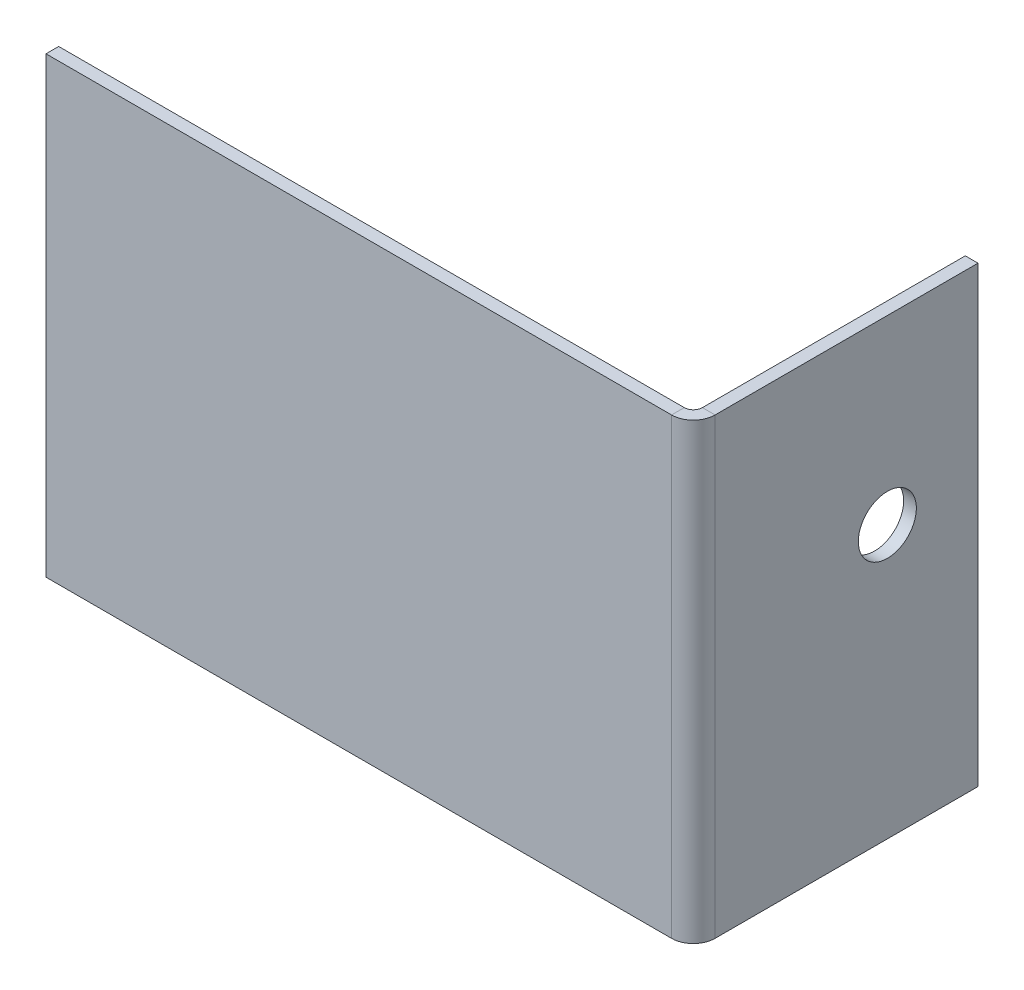
ISO-10303-21;
HEADER;
FILE_DESCRIPTION(('STEP AP214'),'2;1');
FILE_NAME('part.step','',(''),(''),'','','');
FILE_SCHEMA(('AUTOMOTIVE_DESIGN { 1 0 10303 214 1 1 1 1 }'));
ENDSEC;
DATA;
#1=APPLICATION_CONTEXT('core data for automotive mechanical design processes');
#2=APPLICATION_PROTOCOL_DEFINITION('international standard','automotive_design',2000,#1);
#3=PRODUCT_CONTEXT('',#1,'mechanical');
#4=PRODUCT('Part','Part','',(#3));
#5=PRODUCT_RELATED_PRODUCT_CATEGORY('part','',(#4));
#6=PRODUCT_DEFINITION_FORMATION('','',#4);
#7=PRODUCT_DEFINITION_CONTEXT('part definition',#1,'design');
#8=PRODUCT_DEFINITION('design','',#6,#7);
#9=PRODUCT_DEFINITION_SHAPE('','',#8);
#10=(LENGTH_UNIT() NAMED_UNIT(*) SI_UNIT(.MILLI.,.METRE.));
#11=(NAMED_UNIT(*) PLANE_ANGLE_UNIT() SI_UNIT($,.RADIAN.));
#12=(NAMED_UNIT(*) SI_UNIT($,.STERADIAN.) SOLID_ANGLE_UNIT());
#13=UNCERTAINTY_MEASURE_WITH_UNIT(LENGTH_MEASURE(1.E-05),#10,'distance_accuracy_value','');
#14=(GEOMETRIC_REPRESENTATION_CONTEXT(3) GLOBAL_UNCERTAINTY_ASSIGNED_CONTEXT((#13)) GLOBAL_UNIT_ASSIGNED_CONTEXT((#10,
#11,#12)) REPRESENTATION_CONTEXT('',''));
#15=CARTESIAN_POINT('',(0.,0.,0.));
#16=DIRECTION('',(0.,0.,1.));
#17=DIRECTION('',(1.,0.,0.));
#18=AXIS2_PLACEMENT_3D('',#15,#16,#17);
#19=CARTESIAN_POINT('',(-17.5,-12.5,-0.7));
#20=DIRECTION('',(0.,-1.,0.));
#21=DIRECTION('',(0.,0.,-1.));
#22=AXIS2_PLACEMENT_3D('',#19,#20,#21);
#23=PLANE('',#22);
#24=DIRECTION('',(1.,0.,0.));
#25=VECTOR('',#24,1.);
#26=CARTESIAN_POINT('',(-17.5,-12.5,-0.7));
#27=LINE('',#26,#25);
#28=CARTESIAN_POINT('',(-17.5,-12.5,-0.7));
#29=VERTEX_POINT('',#28);
#30=CARTESIAN_POINT('',(17.,-12.5,-0.700000000000001));
#31=VERTEX_POINT('',#30);
#32=EDGE_CURVE('E99',#29,#31,#27,.T.);
#33=ORIENTED_EDGE('',*,*,#32,.T.);
#34=DIRECTION('',(0.,0.,1.));
#35=VECTOR('',#34,1.);
#36=CARTESIAN_POINT('',(17.,-12.5,-0.700000000000001));
#37=LINE('',#36,#35);
#38=CARTESIAN_POINT('',(17.,-12.5,0.));
#39=VERTEX_POINT('',#38);
#40=EDGE_CURVE('E92',#31,#39,#37,.T.);
#41=ORIENTED_EDGE('',*,*,#40,.T.);
#42=DIRECTION('',(1.,0.,0.));
#43=VECTOR('',#42,1.);
#44=CARTESIAN_POINT('',(-17.5,-12.5,0.));
#45=LINE('',#44,#43);
#46=CARTESIAN_POINT('',(-17.5,-12.5,0.));
#47=VERTEX_POINT('',#46);
#48=EDGE_CURVE('E85',#47,#39,#45,.T.);
#49=ORIENTED_EDGE('',*,*,#48,.F.);
#50=DIRECTION('',(0.,0.,1.));
#51=VECTOR('',#50,1.);
#52=CARTESIAN_POINT('',(-17.5,-12.5,-0.7));
#53=LINE('',#52,#51);
#54=EDGE_CURVE('E11',#29,#47,#53,.T.);
#55=ORIENTED_EDGE('',*,*,#54,.F.);
#56=EDGE_LOOP('',(#33,#41,#49,#55));
#57=FACE_BOUND('',#56,.T.);
#58=ADVANCED_FACE('F40',(#57),#23,.T.);
#59=CARTESIAN_POINT('',(0.,0.,-0.7));
#60=DIRECTION('',(0.,0.,1.));
#61=DIRECTION('',(1.,0.,0.));
#62=AXIS2_PLACEMENT_3D('',#59,#60,#61);
#63=PLANE('',#62);
#64=DIRECTION('',(0.,-1.,0.));
#65=VECTOR('',#64,1.);
#66=CARTESIAN_POINT('',(17.,-12.5,-0.700000000000001));
#67=LINE('',#66,#65);
#68=CARTESIAN_POINT('',(17.,12.5,-0.700000000000001));
#69=VERTEX_POINT('',#68);
#70=EDGE_CURVE('E107',#31,#69,#67,.F.);
#71=ORIENTED_EDGE('',*,*,#70,.F.);
#72=ORIENTED_EDGE('',*,*,#32,.F.);
#73=DIRECTION('',(0.,-1.,0.));
#74=VECTOR('',#73,1.);
#75=CARTESIAN_POINT('',(-17.5,12.5,-0.7));
#76=LINE('',#75,#74);
#77=CARTESIAN_POINT('',(-17.5,12.5,-0.7));
#78=VERTEX_POINT('',#77);
#79=EDGE_CURVE('E79',#78,#29,#76,.T.);
#80=ORIENTED_EDGE('',*,*,#79,.F.);
#81=DIRECTION('',(-1.,0.,0.));
#82=VECTOR('',#81,1.);
#83=CARTESIAN_POINT('',(-17.5,12.5,-0.7));
#84=LINE('',#83,#82);
#85=EDGE_CURVE('E93',#69,#78,#84,.T.);
#86=ORIENTED_EDGE('',*,*,#85,.F.);
#87=EDGE_LOOP('',(#71,#72,#80,#86));
#88=FACE_BOUND('',#87,.T.);
#89=ADVANCED_FACE('F215',(#88),#63,.F.);
#90=CARTESIAN_POINT('',(0.,0.,0.));
#91=DIRECTION('',(0.,0.,1.));
#92=DIRECTION('',(1.,0.,0.));
#93=AXIS2_PLACEMENT_3D('',#90,#91,#92);
#94=PLANE('',#93);
#95=ORIENTED_EDGE('',*,*,#48,.T.);
#96=DIRECTION('',(0.,-1.,0.));
#97=VECTOR('',#96,1.);
#98=CARTESIAN_POINT('',(17.,-12.5,0.));
#99=LINE('',#98,#97);
#100=CARTESIAN_POINT('',(17.,12.5,0.));
#101=VERTEX_POINT('',#100);
#102=EDGE_CURVE('E117',#39,#101,#99,.F.);
#103=ORIENTED_EDGE('',*,*,#102,.T.);
#104=DIRECTION('',(-1.,0.,0.));
#105=VECTOR('',#104,1.);
#106=CARTESIAN_POINT('',(-17.5,12.5,0.));
#107=LINE('',#106,#105);
#108=CARTESIAN_POINT('',(-17.5,12.5,0.));
#109=VERTEX_POINT('',#108);
#110=EDGE_CURVE('E87',#101,#109,#107,.T.);
#111=ORIENTED_EDGE('',*,*,#110,.T.);
#112=DIRECTION('',(0.,-1.,0.));
#113=VECTOR('',#112,1.);
#114=CARTESIAN_POINT('',(-17.5,12.5,0.));
#115=LINE('',#114,#113);
#116=EDGE_CURVE('E77',#109,#47,#115,.T.);
#117=ORIENTED_EDGE('',*,*,#116,.T.);
#118=EDGE_LOOP('',(#95,#103,#111,#117));
#119=FACE_BOUND('',#118,.T.);
#120=ADVANCED_FACE('F83',(#119),#94,.T.);
#121=CARTESIAN_POINT('',(-17.5,12.5,-0.7));
#122=DIRECTION('',(-1.,0.,0.));
#123=DIRECTION('',(0.,-1.,0.));
#124=AXIS2_PLACEMENT_3D('',#121,#122,#123);
#125=PLANE('',#124);
#126=ORIENTED_EDGE('',*,*,#116,.F.);
#127=DIRECTION('',(0.,0.,1.));
#128=VECTOR('',#127,1.);
#129=CARTESIAN_POINT('',(-17.5,12.5,-0.7));
#130=LINE('',#129,#128);
#131=EDGE_CURVE('E44',#78,#109,#130,.T.);
#132=ORIENTED_EDGE('',*,*,#131,.F.);
#133=ORIENTED_EDGE('',*,*,#79,.T.);
#134=ORIENTED_EDGE('',*,*,#54,.T.);
#135=EDGE_LOOP('',(#126,#132,#133,#134));
#136=FACE_BOUND('',#135,.T.);
#137=ADVANCED_FACE('F75',(#136),#125,.T.);
#138=CARTESIAN_POINT('',(-17.5,12.5,-0.7));
#139=DIRECTION('',(0.,1.,0.));
#140=DIRECTION('',(0.,0.,1.));
#141=AXIS2_PLACEMENT_3D('',#138,#139,#140);
#142=PLANE('',#141);
#143=DIRECTION('',(0.,0.,1.));
#144=VECTOR('',#143,1.);
#145=CARTESIAN_POINT('',(17.,12.5,-0.700000000000001));
#146=LINE('',#145,#144);
#147=EDGE_CURVE('E98',#69,#101,#146,.T.);
#148=ORIENTED_EDGE('',*,*,#147,.F.);
#149=ORIENTED_EDGE('',*,*,#85,.T.);
#150=ORIENTED_EDGE('',*,*,#131,.T.);
#151=ORIENTED_EDGE('',*,*,#110,.F.);
#152=EDGE_LOOP('',(#148,#149,#150,#151));
#153=FACE_BOUND('',#152,.T.);
#154=ADVANCED_FACE('F42',(#153),#142,.T.);
#155=CARTESIAN_POINT('',(17.,12.5,-1.2));
#156=DIRECTION('',(0.,1.,0.));
#157=DIRECTION('',(0.,0.,1.));
#158=AXIS2_PLACEMENT_3D('',#155,#156,#157);
#159=PLANE('',#158);
#160=DIRECTION('',(1.,0.,0.));
#161=VECTOR('',#160,1.);
#162=CARTESIAN_POINT('',(17.5,12.5,-1.2));
#163=LINE('',#162,#161);
#164=CARTESIAN_POINT('',(17.5,12.5,-1.2));
#165=VERTEX_POINT('',#164);
#166=CARTESIAN_POINT('',(18.2,12.5,-1.19999999999999));
#167=VERTEX_POINT('',#166);
#168=EDGE_CURVE('E146',#165,#167,#163,.T.);
#169=ORIENTED_EDGE('',*,*,#168,.F.);
#170=CARTESIAN_POINT('',(17.,12.5,-1.2));
#171=DIRECTION('',(0.,-1.,0.));
#172=DIRECTION('',(0.,0.,-1.));
#173=AXIS2_PLACEMENT_3D('',#170,#171,#172);
#174=CIRCLE('',#173,0.499999999999997);
#175=EDGE_CURVE('E111',#69,#165,#174,.F.);
#176=ORIENTED_EDGE('',*,*,#175,.F.);
#177=ORIENTED_EDGE('',*,*,#147,.T.);
#178=CARTESIAN_POINT('',(17.,12.5,-1.2));
#179=DIRECTION('',(0.,-1.,0.));
#180=DIRECTION('',(0.,0.,-1.));
#181=AXIS2_PLACEMENT_3D('',#178,#179,#180);
#182=CIRCLE('',#181,1.2);
#183=EDGE_CURVE('E55',#101,#167,#182,.F.);
#184=ORIENTED_EDGE('',*,*,#183,.T.);
#185=EDGE_LOOP('',(#169,#176,#177,#184));
#186=FACE_BOUND('',#185,.T.);
#187=ADVANCED_FACE('F219',(#186),#159,.T.);
#188=CARTESIAN_POINT('',(17.,-12.5,-1.2));
#189=DIRECTION('',(0.,1.,0.));
#190=DIRECTION('',(0.,0.,1.));
#191=AXIS2_PLACEMENT_3D('',#188,#189,#190);
#192=PLANE('',#191);
#193=CARTESIAN_POINT('',(17.,-12.5,-1.2));
#194=DIRECTION('',(0.,-1.,0.));
#195=DIRECTION('',(0.,0.,-1.));
#196=AXIS2_PLACEMENT_3D('',#193,#194,#195);
#197=CIRCLE('',#196,0.499999999999997);
#198=CARTESIAN_POINT('',(17.5,-12.5,-1.2));
#199=VERTEX_POINT('',#198);
#200=EDGE_CURVE('E104',#199,#31,#197,.T.);
#201=ORIENTED_EDGE('',*,*,#200,.F.);
#202=DIRECTION('',(1.,0.,0.));
#203=VECTOR('',#202,1.);
#204=CARTESIAN_POINT('',(17.5,-12.5,-1.2));
#205=LINE('',#204,#203);
#206=CARTESIAN_POINT('',(18.2,-12.5,-1.19999999999999));
#207=VERTEX_POINT('',#206);
#208=EDGE_CURVE('E145',#199,#207,#205,.T.);
#209=ORIENTED_EDGE('',*,*,#208,.T.);
#210=CARTESIAN_POINT('',(17.,-12.5,-1.2));
#211=DIRECTION('',(0.,-1.,0.));
#212=DIRECTION('',(0.,0.,-1.));
#213=AXIS2_PLACEMENT_3D('',#210,#211,#212);
#214=CIRCLE('',#213,1.2);
#215=EDGE_CURVE('E114',#207,#39,#214,.T.);
#216=ORIENTED_EDGE('',*,*,#215,.T.);
#217=ORIENTED_EDGE('',*,*,#40,.F.);
#218=EDGE_LOOP('',(#201,#209,#216,#217));
#219=FACE_BOUND('',#218,.T.);
#220=ADVANCED_FACE('F207',(#219),#192,.F.);
#221=CARTESIAN_POINT('',(17.,-12.5,-1.2));
#222=DIRECTION('',(0.,-1.,0.));
#223=DIRECTION('',(1.,0.,0.));
#224=AXIS2_PLACEMENT_3D('',#221,#222,#223);
#225=CYLINDRICAL_SURFACE('',#224,1.2);
#226=ORIENTED_EDGE('',*,*,#102,.F.);
#227=ORIENTED_EDGE('',*,*,#215,.F.);
#228=DIRECTION('',(0.,1.,0.));
#229=VECTOR('',#228,1.);
#230=CARTESIAN_POINT('',(18.2,0.,-1.19999999999999));
#231=LINE('',#230,#229);
#232=EDGE_CURVE('E136',#207,#167,#231,.T.);
#233=ORIENTED_EDGE('',*,*,#232,.T.);
#234=ORIENTED_EDGE('',*,*,#183,.F.);
#235=EDGE_LOOP('',(#226,#227,#233,#234));
#236=FACE_BOUND('',#235,.T.);
#237=ADVANCED_FACE('F220',(#236),#225,.T.);
#238=CARTESIAN_POINT('',(17.,-12.5,-1.2));
#239=DIRECTION('',(0.,-1.,0.));
#240=DIRECTION('',(1.,0.,0.));
#241=AXIS2_PLACEMENT_3D('',#238,#239,#240);
#242=CYLINDRICAL_SURFACE('',#241,0.499999999999997);
#243=ORIENTED_EDGE('',*,*,#70,.T.);
#244=ORIENTED_EDGE('',*,*,#175,.T.);
#245=DIRECTION('',(0.,-1.,0.));
#246=VECTOR('',#245,1.);
#247=CARTESIAN_POINT('',(17.5,12.5,-1.2));
#248=LINE('',#247,#246);
#249=EDGE_CURVE('E149',#165,#199,#248,.T.);
#250=ORIENTED_EDGE('',*,*,#249,.T.);
#251=ORIENTED_EDGE('',*,*,#200,.T.);
#252=EDGE_LOOP('',(#243,#244,#250,#251));
#253=FACE_BOUND('',#252,.T.);
#254=ADVANCED_FACE('F211',(#253),#242,.F.);
#255=CARTESIAN_POINT('',(18.2000000000001,-12.5,-15.7));
#256=DIRECTION('',(0.,1.,0.));
#257=DIRECTION('',(-1.,0.,0.));
#258=AXIS2_PLACEMENT_3D('',#255,#256,#257);
#259=PLANE('',#258);
#260=ORIENTED_EDGE('',*,*,#208,.F.);
#261=DIRECTION('',(0.,0.,-1.));
#262=VECTOR('',#261,1.);
#263=CARTESIAN_POINT('',(17.5000000000001,-12.5,-15.7));
#264=LINE('',#263,#262);
#265=CARTESIAN_POINT('',(17.5000000000001,-12.5,-15.7));
#266=VERTEX_POINT('',#265);
#267=EDGE_CURVE('E133',#199,#266,#264,.T.);
#268=ORIENTED_EDGE('',*,*,#267,.T.);
#269=DIRECTION('',(-1.,0.,0.));
#270=VECTOR('',#269,1.);
#271=CARTESIAN_POINT('',(18.2000000000001,-12.5,-15.7));
#272=LINE('',#271,#270);
#273=CARTESIAN_POINT('',(18.2000000000001,-12.5,-15.7));
#274=VERTEX_POINT('',#273);
#275=EDGE_CURVE('E108',#274,#266,#272,.T.);
#276=ORIENTED_EDGE('',*,*,#275,.F.);
#277=DIRECTION('',(0.,0.,-1.));
#278=VECTOR('',#277,1.);
#279=CARTESIAN_POINT('',(18.2000000000001,-12.5,-15.7));
#280=LINE('',#279,#278);
#281=EDGE_CURVE('E129',#207,#274,#280,.T.);
#282=ORIENTED_EDGE('',*,*,#281,.F.);
#283=EDGE_LOOP('',(#260,#268,#276,#282));
#284=FACE_BOUND('',#283,.T.);
#285=ADVANCED_FACE('F180',(#284),#259,.F.);
#286=CARTESIAN_POINT('',(18.2,12.5,-0.699999999999998));
#287=DIRECTION('',(0.,-1.,0.));
#288=DIRECTION('',(1.,0.,0.));
#289=AXIS2_PLACEMENT_3D('',#286,#287,#288);
#290=PLANE('',#289);
#291=ORIENTED_EDGE('',*,*,#168,.T.);
#292=DIRECTION('',(0.,0.,1.));
#293=VECTOR('',#292,1.);
#294=CARTESIAN_POINT('',(18.2,12.5,-0.699999999999998));
#295=LINE('',#294,#293);
#296=CARTESIAN_POINT('',(18.2000000000001,12.5,-15.7));
#297=VERTEX_POINT('',#296);
#298=EDGE_CURVE('E125',#297,#167,#295,.T.);
#299=ORIENTED_EDGE('',*,*,#298,.F.);
#300=DIRECTION('',(-1.,0.,0.));
#301=VECTOR('',#300,1.);
#302=CARTESIAN_POINT('',(18.2000000000001,12.5,-15.7));
#303=LINE('',#302,#301);
#304=CARTESIAN_POINT('',(17.5000000000001,12.5,-15.7));
#305=VERTEX_POINT('',#304);
#306=EDGE_CURVE('E122',#297,#305,#303,.T.);
#307=ORIENTED_EDGE('',*,*,#306,.T.);
#308=DIRECTION('',(0.,0.,1.));
#309=VECTOR('',#308,1.);
#310=CARTESIAN_POINT('',(17.5,12.5,-0.7));
#311=LINE('',#310,#309);
#312=EDGE_CURVE('E126',#305,#165,#311,.T.);
#313=ORIENTED_EDGE('',*,*,#312,.T.);
#314=EDGE_LOOP('',(#291,#299,#307,#313));
#315=FACE_BOUND('',#314,.T.);
#316=ADVANCED_FACE('F313',(#315),#290,.F.);
#317=CARTESIAN_POINT('',(18.2,0.,0.));
#318=DIRECTION('',(-1.,0.,0.));
#319=DIRECTION('',(0.,0.,1.));
#320=AXIS2_PLACEMENT_3D('',#317,#318,#319);
#321=PLANE('',#320);
#322=CARTESIAN_POINT('',(18.2,2.5,-10.6999999999999));
#323=DIRECTION('',(-1.,0.,0.));
#324=DIRECTION('',(0.,0.,1.));
#325=AXIS2_PLACEMENT_3D('',#322,#323,#324);
#326=CIRCLE('',#325,1.6);
#327=CARTESIAN_POINT('',(18.2,2.5,-9.09999999999988));
#328=VERTEX_POINT('',#327);
#329=EDGE_CURVE('E150',#328,#328,#326,.F.);
#330=ORIENTED_EDGE('',*,*,#329,.F.);
#331=EDGE_LOOP('',(#330));
#332=FACE_BOUND('',#331,.T.);
#333=ORIENTED_EDGE('',*,*,#232,.F.);
#334=ORIENTED_EDGE('',*,*,#281,.T.);
#335=DIRECTION('',(0.,1.,0.));
#336=VECTOR('',#335,1.);
#337=CARTESIAN_POINT('',(18.2000000000001,12.5,-15.7));
#338=LINE('',#337,#336);
#339=EDGE_CURVE('E139',#274,#297,#338,.T.);
#340=ORIENTED_EDGE('',*,*,#339,.T.);
#341=ORIENTED_EDGE('',*,*,#298,.T.);
#342=EDGE_LOOP('',(#333,#334,#340,#341));
#343=FACE_BOUND('',#342,.T.);
#344=ADVANCED_FACE('F167',(#332,#343),#321,.F.);
#345=CARTESIAN_POINT('',(17.5,0.,0.));
#346=DIRECTION('',(-1.,0.,0.));
#347=DIRECTION('',(0.,0.,1.));
#348=AXIS2_PLACEMENT_3D('',#345,#346,#347);
#349=PLANE('',#348);
#350=CARTESIAN_POINT('',(17.5,2.5,-10.6999999999999));
#351=DIRECTION('',(-1.,0.,0.));
#352=DIRECTION('',(0.,0.,1.));
#353=AXIS2_PLACEMENT_3D('',#350,#351,#352);
#354=CIRCLE('',#353,1.6);
#355=CARTESIAN_POINT('',(17.5,2.5,-9.09999999999988));
#356=VERTEX_POINT('',#355);
#357=EDGE_CURVE('E157',#356,#356,#354,.T.);
#358=ORIENTED_EDGE('',*,*,#357,.F.);
#359=EDGE_LOOP('',(#358));
#360=FACE_BOUND('',#359,.T.);
#361=ORIENTED_EDGE('',*,*,#267,.F.);
#362=ORIENTED_EDGE('',*,*,#249,.F.);
#363=ORIENTED_EDGE('',*,*,#312,.F.);
#364=DIRECTION('',(0.,1.,0.));
#365=VECTOR('',#364,1.);
#366=CARTESIAN_POINT('',(17.5000000000001,12.5,-15.7));
#367=LINE('',#366,#365);
#368=EDGE_CURVE('E130',#266,#305,#367,.T.);
#369=ORIENTED_EDGE('',*,*,#368,.F.);
#370=EDGE_LOOP('',(#361,#362,#363,#369));
#371=FACE_BOUND('',#370,.T.);
#372=ADVANCED_FACE('F163',(#360,#371),#349,.T.);
#373=CARTESIAN_POINT('',(18.2000000000001,12.5,-15.7));
#374=DIRECTION('',(0.,0.,1.));
#375=DIRECTION('',(1.,0.,0.));
#376=AXIS2_PLACEMENT_3D('',#373,#374,#375);
#377=PLANE('',#376);
#378=ORIENTED_EDGE('',*,*,#368,.T.);
#379=ORIENTED_EDGE('',*,*,#306,.F.);
#380=ORIENTED_EDGE('',*,*,#339,.F.);
#381=ORIENTED_EDGE('',*,*,#275,.T.);
#382=EDGE_LOOP('',(#378,#379,#380,#381));
#383=FACE_BOUND('',#382,.T.);
#384=ADVANCED_FACE('F166',(#383),#377,.F.);
#385=CARTESIAN_POINT('',(22.725483399594,2.5,-10.6999999999999));
#386=DIRECTION('',(-1.,0.,0.));
#387=DIRECTION('',(0.,0.,1.));
#388=AXIS2_PLACEMENT_3D('',#385,#386,#387);
#389=CYLINDRICAL_SURFACE('',#388,1.6);
#390=CARTESIAN_POINT('',(18.2,2.5,-9.09999999999988));
#391=CARTESIAN_POINT('',(18.1927083333334,2.5,-9.09999999999988));
#392=CARTESIAN_POINT('',(18.1854166666667,2.5,-9.09999999999988));
#393=CARTESIAN_POINT('',(18.1708333333334,2.5,-9.09999999999988));
#394=CARTESIAN_POINT('',(18.1635416666667,2.5,-9.09999999999988));
#395=CARTESIAN_POINT('',(18.1489583333334,2.5,-9.09999999999988));
#396=CARTESIAN_POINT('',(18.1416666666667,2.5,-9.09999999999988));
#397=CARTESIAN_POINT('',(18.1270833333334,2.5,-9.09999999999988));
#398=CARTESIAN_POINT('',(18.1197916666667,2.5,-9.09999999999988));
#399=CARTESIAN_POINT('',(18.1052083333334,2.5,-9.09999999999988));
#400=CARTESIAN_POINT('',(18.0979166666667,2.5,-9.09999999999988));
#401=CARTESIAN_POINT('',(18.0833333333334,2.5,-9.09999999999988));
#402=CARTESIAN_POINT('',(18.0760416666667,2.5,-9.09999999999988));
#403=CARTESIAN_POINT('',(18.0614583333334,2.5,-9.09999999999988));
#404=CARTESIAN_POINT('',(18.0541666666667,2.5,-9.09999999999988));
#405=CARTESIAN_POINT('',(18.0395833333334,2.5,-9.09999999999988));
#406=CARTESIAN_POINT('',(18.0322916666667,2.5,-9.09999999999988));
#407=CARTESIAN_POINT('',(18.0177083333334,2.5,-9.09999999999988));
#408=CARTESIAN_POINT('',(18.0104166666667,2.5,-9.09999999999988));
#409=CARTESIAN_POINT('',(17.9958333333334,2.5,-9.09999999999988));
#410=CARTESIAN_POINT('',(17.9885416666667,2.5,-9.09999999999988));
#411=CARTESIAN_POINT('',(17.9739583333334,2.5,-9.09999999999988));
#412=CARTESIAN_POINT('',(17.9666666666667,2.5,-9.09999999999988));
#413=CARTESIAN_POINT('',(17.9520833333334,2.5,-9.09999999999988));
#414=CARTESIAN_POINT('',(17.9447916666667,2.5,-9.09999999999988));
#415=CARTESIAN_POINT('',(17.9302083333334,2.5,-9.09999999999988));
#416=CARTESIAN_POINT('',(17.9229166666667,2.5,-9.09999999999988));
#417=CARTESIAN_POINT('',(17.9083333333334,2.5,-9.09999999999988));
#418=CARTESIAN_POINT('',(17.9010416666667,2.5,-9.09999999999988));
#419=CARTESIAN_POINT('',(17.8864583333334,2.5,-9.09999999999988));
#420=CARTESIAN_POINT('',(17.8791666666667,2.5,-9.09999999999988));
#421=CARTESIAN_POINT('',(17.8645833333334,2.5,-9.09999999999988));
#422=CARTESIAN_POINT('',(17.8572916666667,2.5,-9.09999999999988));
#423=CARTESIAN_POINT('',(17.8427083333334,2.5,-9.09999999999988));
#424=CARTESIAN_POINT('',(17.8354166666667,2.5,-9.09999999999988));
#425=CARTESIAN_POINT('',(17.8208333333334,2.5,-9.09999999999988));
#426=CARTESIAN_POINT('',(17.8135416666667,2.5,-9.09999999999988));
#427=CARTESIAN_POINT('',(17.7989583333334,2.5,-9.09999999999988));
#428=CARTESIAN_POINT('',(17.7916666666667,2.5,-9.09999999999988));
#429=CARTESIAN_POINT('',(17.7770833333334,2.5,-9.09999999999988));
#430=CARTESIAN_POINT('',(17.7697916666667,2.5,-9.09999999999988));
#431=CARTESIAN_POINT('',(17.7552083333334,2.5,-9.09999999999988));
#432=CARTESIAN_POINT('',(17.7479166666667,2.5,-9.09999999999988));
#433=CARTESIAN_POINT('',(17.7333333333334,2.5,-9.09999999999988));
#434=CARTESIAN_POINT('',(17.7260416666667,2.5,-9.09999999999988));
#435=CARTESIAN_POINT('',(17.7114583333334,2.5,-9.09999999999988));
#436=CARTESIAN_POINT('',(17.7041666666667,2.5,-9.09999999999988));
#437=CARTESIAN_POINT('',(17.6895833333334,2.5,-9.09999999999988));
#438=CARTESIAN_POINT('',(17.6822916666667,2.5,-9.09999999999988));
#439=CARTESIAN_POINT('',(17.6677083333334,2.5,-9.09999999999988));
#440=CARTESIAN_POINT('',(17.6604166666667,2.5,-9.09999999999988));
#441=CARTESIAN_POINT('',(17.6458333333334,2.5,-9.09999999999988));
#442=CARTESIAN_POINT('',(17.6385416666667,2.5,-9.09999999999988));
#443=CARTESIAN_POINT('',(17.6239583333334,2.5,-9.09999999999988));
#444=CARTESIAN_POINT('',(17.6166666666667,2.5,-9.09999999999988));
#445=CARTESIAN_POINT('',(17.6020833333334,2.5,-9.09999999999988));
#446=CARTESIAN_POINT('',(17.5947916666667,2.5,-9.09999999999988));
#447=CARTESIAN_POINT('',(17.5802083333334,2.5,-9.09999999999988));
#448=CARTESIAN_POINT('',(17.5729166666667,2.5,-9.09999999999988));
#449=CARTESIAN_POINT('',(17.5583333333334,2.5,-9.09999999999988));
#450=CARTESIAN_POINT('',(17.5510416666667,2.5,-9.09999999999988));
#451=CARTESIAN_POINT('',(17.5364583333334,2.5,-9.09999999999988));
#452=CARTESIAN_POINT('',(17.5291666666667,2.5,-9.09999999999988));
#453=CARTESIAN_POINT('',(17.5145833333334,2.5,-9.09999999999988));
#454=CARTESIAN_POINT('',(17.5072916666667,2.5,-9.09999999999988));
#455=CARTESIAN_POINT('',(17.5,2.5,-9.09999999999988));
#456=B_SPLINE_CURVE_WITH_KNOTS('',3,(#390,#391,#392,#393,#394,#395,#396,#397,#398,#399,#400,
#401,#402,#403,#404,#405,#406,#407,#408,#409,#410,#411,#412,#413,#414,#415,#416,#417,#418,#419,
#420,#421,#422,#423,#424,#425,#426,#427,#428,#429,#430,#431,#432,#433,#434,#435,#436,#437,#438,
#439,#440,#441,#442,#443,#444,#445,#446,#447,#448,#449,#450,#451,#452,#453,#454,#455),
.UNSPECIFIED.,.F.,.F.,(4,2,2,2,2,2,2,2,2,2,2,2,2,2,2,2,2,2,2,2,2,2,2,2,2,2,2,2,2,2,2,2,4),(0.,
0.0218750000000011,0.0437500000000021,0.0656249999999997,0.0875000000000008,0.109375000000002,
0.131249999999999,0.153125,0.175000000000002,0.196875000000003,0.21875,0.240625000000001,
0.262500000000002,0.284375,0.306250000000001,0.328125000000002,0.35,0.371875000000001,
0.393750000000002,0.415624999999999,0.4375,0.459375000000001,0.481249999999999,0.503125,
0.525000000000001,0.546874999999999,0.56875,0.590625000000001,0.612499999999998,
0.634374999999999,0.656250000000001,0.678124999999998,0.699999999999999),.UNSPECIFIED.);
#457=EDGE_CURVE('BSEAM161',#328,#356,#456,.T.);
#458=ORIENTED_EDGE('',*,*,#329,.T.);
#459=ORIENTED_EDGE('',*,*,#357,.T.);
#460=ORIENTED_EDGE('',*,*,#457,.T.);
#461=ORIENTED_EDGE('',*,*,#457,.F.);
#462=EDGE_LOOP('',(#458,#460,#459,#461));
#463=FACE_BOUND('',#462,.T.);
#464=ADVANCED_FACE('F161',(#463),#389,.F.);
#465=CLOSED_SHELL('',(#58,#89,#120,#137,#154,#187,#220,#237,#254,#285,#316,#344,#372,#384,#464));
#466=MANIFOLD_SOLID_BREP('B2',#465);
#467=ADVANCED_BREP_SHAPE_REPRESENTATION('',(#18,#466),#14);
#468=SHAPE_DEFINITION_REPRESENTATION(#9,#467);
ENDSEC;
END-ISO-10303-21;
